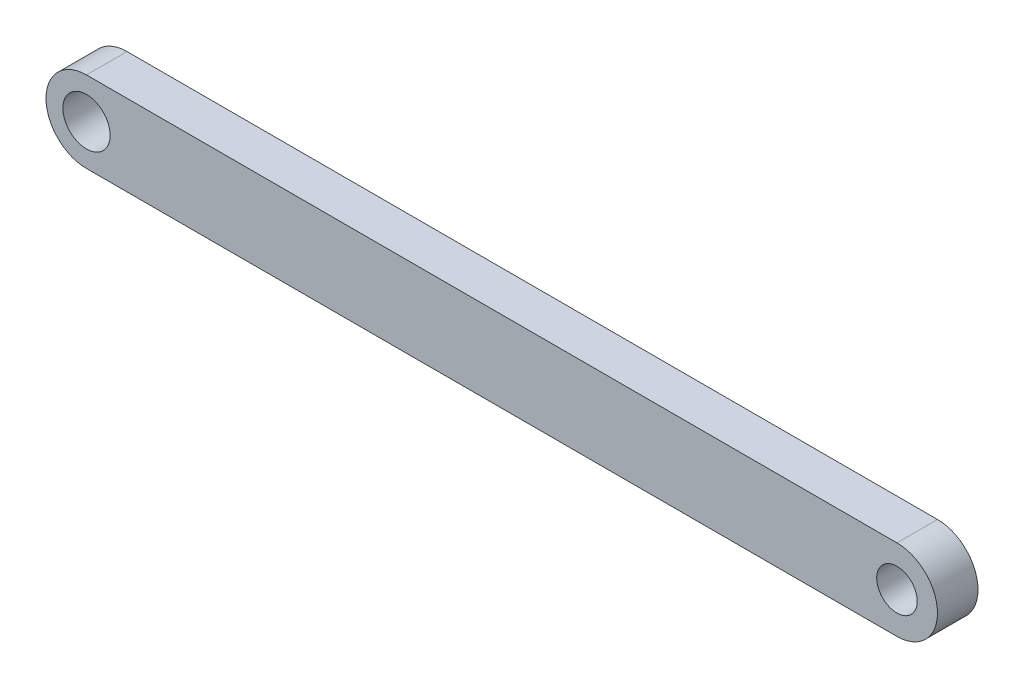
ISO-10303-21;
HEADER;
FILE_DESCRIPTION(('STEP AP214'),'2;1');
FILE_NAME('part.step','',(''),(''),'','','');
FILE_SCHEMA(('AUTOMOTIVE_DESIGN { 1 0 10303 214 1 1 1 1 }'));
ENDSEC;
DATA;
#1=APPLICATION_CONTEXT('core data for automotive mechanical design processes');
#2=APPLICATION_PROTOCOL_DEFINITION('international standard','automotive_design',2000,#1);
#3=PRODUCT_CONTEXT('',#1,'mechanical');
#4=PRODUCT('Part','Part','',(#3));
#5=PRODUCT_RELATED_PRODUCT_CATEGORY('part','',(#4));
#6=PRODUCT_DEFINITION_FORMATION('','',#4);
#7=PRODUCT_DEFINITION_CONTEXT('part definition',#1,'design');
#8=PRODUCT_DEFINITION('design','',#6,#7);
#9=PRODUCT_DEFINITION_SHAPE('','',#8);
#10=(LENGTH_UNIT() NAMED_UNIT(*) SI_UNIT(.MILLI.,.METRE.));
#11=(NAMED_UNIT(*) PLANE_ANGLE_UNIT() SI_UNIT($,.RADIAN.));
#12=(NAMED_UNIT(*) SI_UNIT($,.STERADIAN.) SOLID_ANGLE_UNIT());
#13=UNCERTAINTY_MEASURE_WITH_UNIT(LENGTH_MEASURE(1.E-05),#10,'distance_accuracy_value','');
#14=(GEOMETRIC_REPRESENTATION_CONTEXT(3) GLOBAL_UNCERTAINTY_ASSIGNED_CONTEXT((#13)) GLOBAL_UNIT_ASSIGNED_CONTEXT((#10,
#11,#12)) REPRESENTATION_CONTEXT('',''));
#15=CARTESIAN_POINT('',(0.,0.,0.));
#16=DIRECTION('',(0.,0.,1.));
#17=DIRECTION('',(1.,0.,0.));
#18=AXIS2_PLACEMENT_3D('',#15,#16,#17);
#19=CARTESIAN_POINT('',(0.,0.,3.));
#20=DIRECTION('',(0.,0.,1.));
#21=DIRECTION('',(1.,0.,0.));
#22=AXIS2_PLACEMENT_3D('',#19,#20,#21);
#23=PLANE('',#22);
#24=CARTESIAN_POINT('',(0.,0.,3.));
#25=DIRECTION('',(0.,0.,1.));
#26=DIRECTION('',(1.,0.,0.));
#27=AXIS2_PLACEMENT_3D('',#24,#25,#26);
#28=CIRCLE('',#27,1.75);
#29=CARTESIAN_POINT('',(1.75,0.,3.));
#30=VERTEX_POINT('',#29);
#31=EDGE_CURVE('E100',#30,#30,#28,.T.);
#32=ORIENTED_EDGE('',*,*,#31,.F.);
#33=EDGE_LOOP('',(#32));
#34=FACE_BOUND('',#33,.T.);
#35=CARTESIAN_POINT('',(0.,0.,3.));
#36=DIRECTION('',(0.,0.,1.));
#37=DIRECTION('',(1.,0.,0.));
#38=AXIS2_PLACEMENT_3D('',#35,#36,#37);
#39=CIRCLE('',#38,3.);
#40=CARTESIAN_POINT('',(0.,3.,3.));
#41=VERTEX_POINT('',#40);
#42=CARTESIAN_POINT('',(0.,-3.,3.));
#43=VERTEX_POINT('',#42);
#44=EDGE_CURVE('E85',#41,#43,#39,.T.);
#45=ORIENTED_EDGE('',*,*,#44,.T.);
#46=DIRECTION('',(1.,0.,0.));
#47=VECTOR('',#46,1.);
#48=CARTESIAN_POINT('',(0.,-3.,3.));
#49=LINE('',#48,#47);
#50=CARTESIAN_POINT('',(60.,-3.,3.));
#51=VERTEX_POINT('',#50);
#52=EDGE_CURVE('E80',#43,#51,#49,.T.);
#53=ORIENTED_EDGE('',*,*,#52,.T.);
#54=CARTESIAN_POINT('',(60.,0.,3.));
#55=DIRECTION('',(0.,0.,1.));
#56=DIRECTION('',(1.,0.,0.));
#57=AXIS2_PLACEMENT_3D('',#54,#55,#56);
#58=CIRCLE('',#57,3.);
#59=CARTESIAN_POINT('',(60.,3.,3.));
#60=VERTEX_POINT('',#59);
#61=EDGE_CURVE('E83',#51,#60,#58,.T.);
#62=ORIENTED_EDGE('',*,*,#61,.T.);
#63=DIRECTION('',(-1.,0.,0.));
#64=VECTOR('',#63,1.);
#65=CARTESIAN_POINT('',(0.,3.,3.));
#66=LINE('',#65,#64);
#67=EDGE_CURVE('E50',#60,#41,#66,.T.);
#68=ORIENTED_EDGE('',*,*,#67,.T.);
#69=EDGE_LOOP('',(#45,#53,#62,#68));
#70=FACE_BOUND('',#69,.T.);
#71=CARTESIAN_POINT('',(60.,0.,3.));
#72=DIRECTION('',(0.,0.,1.));
#73=DIRECTION('',(1.,0.,0.));
#74=AXIS2_PLACEMENT_3D('',#71,#72,#73);
#75=CIRCLE('',#74,1.5);
#76=CARTESIAN_POINT('',(61.5,0.,3.));
#77=VERTEX_POINT('',#76);
#78=EDGE_CURVE('E115',#77,#77,#75,.T.);
#79=ORIENTED_EDGE('',*,*,#78,.F.);
#80=EDGE_LOOP('',(#79));
#81=FACE_BOUND('',#80,.T.);
#82=ADVANCED_FACE('F33',(#34,#70,#81),#23,.T.);
#83=CARTESIAN_POINT('',(0.,0.,0.));
#84=DIRECTION('',(0.,0.,1.));
#85=DIRECTION('',(1.,0.,0.));
#86=AXIS2_PLACEMENT_3D('',#83,#84,#85);
#87=PLANE('',#86);
#88=CARTESIAN_POINT('',(0.,0.,0.));
#89=DIRECTION('',(0.,0.,1.));
#90=DIRECTION('',(1.,0.,0.));
#91=AXIS2_PLACEMENT_3D('',#88,#89,#90);
#92=CIRCLE('',#91,3.);
#93=CARTESIAN_POINT('',(0.,3.,0.));
#94=VERTEX_POINT('',#93);
#95=CARTESIAN_POINT('',(0.,-3.,0.));
#96=VERTEX_POINT('',#95);
#97=EDGE_CURVE('E97',#94,#96,#92,.T.);
#98=ORIENTED_EDGE('',*,*,#97,.F.);
#99=DIRECTION('',(-1.,0.,0.));
#100=VECTOR('',#99,1.);
#101=CARTESIAN_POINT('',(0.,3.,0.));
#102=LINE('',#101,#100);
#103=CARTESIAN_POINT('',(60.,3.,0.));
#104=VERTEX_POINT('',#103);
#105=EDGE_CURVE('E73',#104,#94,#102,.T.);
#106=ORIENTED_EDGE('',*,*,#105,.F.);
#107=CARTESIAN_POINT('',(60.,0.,0.));
#108=DIRECTION('',(0.,0.,1.));
#109=DIRECTION('',(1.,0.,0.));
#110=AXIS2_PLACEMENT_3D('',#107,#108,#109);
#111=CIRCLE('',#110,3.);
#112=CARTESIAN_POINT('',(60.,-3.,0.));
#113=VERTEX_POINT('',#112);
#114=EDGE_CURVE('E67',#113,#104,#111,.T.);
#115=ORIENTED_EDGE('',*,*,#114,.F.);
#116=DIRECTION('',(1.,0.,0.));
#117=VECTOR('',#116,1.);
#118=CARTESIAN_POINT('',(0.,-3.,0.));
#119=LINE('',#118,#117);
#120=EDGE_CURVE('E89',#96,#113,#119,.T.);
#121=ORIENTED_EDGE('',*,*,#120,.F.);
#122=EDGE_LOOP('',(#98,#106,#115,#121));
#123=FACE_BOUND('',#122,.T.);
#124=CARTESIAN_POINT('',(0.,0.,0.));
#125=DIRECTION('',(0.,0.,1.));
#126=DIRECTION('',(1.,0.,0.));
#127=AXIS2_PLACEMENT_3D('',#124,#125,#126);
#128=CIRCLE('',#127,1.75);
#129=CARTESIAN_POINT('',(1.75,0.,0.));
#130=VERTEX_POINT('',#129);
#131=EDGE_CURVE('E112',#130,#130,#128,.T.);
#132=ORIENTED_EDGE('',*,*,#131,.T.);
#133=EDGE_LOOP('',(#132));
#134=FACE_BOUND('',#133,.T.);
#135=CARTESIAN_POINT('',(60.,0.,0.));
#136=DIRECTION('',(0.,0.,1.));
#137=DIRECTION('',(1.,0.,0.));
#138=AXIS2_PLACEMENT_3D('',#135,#136,#137);
#139=CIRCLE('',#138,1.5);
#140=CARTESIAN_POINT('',(61.5,0.,0.));
#141=VERTEX_POINT('',#140);
#142=EDGE_CURVE('E118',#141,#141,#139,.T.);
#143=ORIENTED_EDGE('',*,*,#142,.T.);
#144=EDGE_LOOP('',(#143));
#145=FACE_BOUND('',#144,.T.);
#146=ADVANCED_FACE('F108',(#123,#134,#145),#87,.F.);
#147=CARTESIAN_POINT('',(0.,0.,3.));
#148=DIRECTION('',(0.,0.,-1.));
#149=DIRECTION('',(-1.,0.,0.));
#150=AXIS2_PLACEMENT_3D('',#147,#148,#149);
#151=CYLINDRICAL_SURFACE('',#150,3.);
#152=ORIENTED_EDGE('',*,*,#97,.T.);
#153=DIRECTION('',(0.,0.,-1.));
#154=VECTOR('',#153,1.);
#155=CARTESIAN_POINT('',(0.,-3.,3.));
#156=LINE('',#155,#154);
#157=EDGE_CURVE('E11',#43,#96,#156,.T.);
#158=ORIENTED_EDGE('',*,*,#157,.F.);
#159=ORIENTED_EDGE('',*,*,#44,.F.);
#160=DIRECTION('',(0.,0.,-1.));
#161=VECTOR('',#160,1.);
#162=CARTESIAN_POINT('',(0.,3.,3.));
#163=LINE('',#162,#161);
#164=EDGE_CURVE('E93',#41,#94,#163,.T.);
#165=ORIENTED_EDGE('',*,*,#164,.T.);
#166=EDGE_LOOP('',(#152,#158,#159,#165));
#167=FACE_BOUND('',#166,.T.);
#168=ADVANCED_FACE('F35',(#167),#151,.T.);
#169=CARTESIAN_POINT('',(0.,-3.,3.));
#170=DIRECTION('',(0.,1.,0.));
#171=DIRECTION('',(0.,0.,1.));
#172=AXIS2_PLACEMENT_3D('',#169,#170,#171);
#173=PLANE('',#172);
#174=ORIENTED_EDGE('',*,*,#120,.T.);
#175=DIRECTION('',(0.,0.,-1.));
#176=VECTOR('',#175,1.);
#177=CARTESIAN_POINT('',(60.,-3.,3.));
#178=LINE('',#177,#176);
#179=EDGE_CURVE('E42',#51,#113,#178,.T.);
#180=ORIENTED_EDGE('',*,*,#179,.F.);
#181=ORIENTED_EDGE('',*,*,#52,.F.);
#182=ORIENTED_EDGE('',*,*,#157,.T.);
#183=EDGE_LOOP('',(#174,#180,#181,#182));
#184=FACE_BOUND('',#183,.T.);
#185=ADVANCED_FACE('F88',(#184),#173,.F.);
#186=CARTESIAN_POINT('',(60.,0.,3.));
#187=DIRECTION('',(0.,0.,-1.));
#188=DIRECTION('',(-1.,0.,0.));
#189=AXIS2_PLACEMENT_3D('',#186,#187,#188);
#190=CYLINDRICAL_SURFACE('',#189,3.);
#191=ORIENTED_EDGE('',*,*,#114,.T.);
#192=DIRECTION('',(0.,0.,-1.));
#193=VECTOR('',#192,1.);
#194=CARTESIAN_POINT('',(60.,3.,3.));
#195=LINE('',#194,#193);
#196=EDGE_CURVE('E90',#60,#104,#195,.T.);
#197=ORIENTED_EDGE('',*,*,#196,.F.);
#198=ORIENTED_EDGE('',*,*,#61,.F.);
#199=ORIENTED_EDGE('',*,*,#179,.T.);
#200=EDGE_LOOP('',(#191,#197,#198,#199));
#201=FACE_BOUND('',#200,.T.);
#202=ADVANCED_FACE('F91',(#201),#190,.T.);
#203=CARTESIAN_POINT('',(0.,3.,3.));
#204=DIRECTION('',(0.,-1.,0.));
#205=DIRECTION('',(0.,0.,-1.));
#206=AXIS2_PLACEMENT_3D('',#203,#204,#205);
#207=PLANE('',#206);
#208=ORIENTED_EDGE('',*,*,#105,.T.);
#209=ORIENTED_EDGE('',*,*,#164,.F.);
#210=ORIENTED_EDGE('',*,*,#67,.F.);
#211=ORIENTED_EDGE('',*,*,#196,.T.);
#212=EDGE_LOOP('',(#208,#209,#210,#211));
#213=FACE_BOUND('',#212,.T.);
#214=ADVANCED_FACE('F105',(#213),#207,.F.);
#215=CARTESIAN_POINT('',(0.,0.,3.));
#216=DIRECTION('',(0.,0.,-1.));
#217=DIRECTION('',(-1.,0.,0.));
#218=AXIS2_PLACEMENT_3D('',#215,#216,#217);
#219=CYLINDRICAL_SURFACE('',#218,1.75);
#220=ORIENTED_EDGE('',*,*,#31,.T.);
#221=EDGE_LOOP('',(#220));
#222=FACE_BOUND('',#221,.T.);
#223=ORIENTED_EDGE('',*,*,#131,.F.);
#224=EDGE_LOOP('',(#223));
#225=FACE_BOUND('',#224,.T.);
#226=ADVANCED_FACE('F135',(#222,#225),#219,.F.);
#227=CARTESIAN_POINT('',(60.,0.,3.));
#228=DIRECTION('',(0.,0.,-1.));
#229=DIRECTION('',(-1.,0.,0.));
#230=AXIS2_PLACEMENT_3D('',#227,#228,#229);
#231=CYLINDRICAL_SURFACE('',#230,1.5);
#232=ORIENTED_EDGE('',*,*,#78,.T.);
#233=EDGE_LOOP('',(#232));
#234=FACE_BOUND('',#233,.T.);
#235=ORIENTED_EDGE('',*,*,#142,.F.);
#236=EDGE_LOOP('',(#235));
#237=FACE_BOUND('',#236,.T.);
#238=ADVANCED_FACE('F124',(#234,#237),#231,.F.);
#239=CLOSED_SHELL('',(#82,#146,#168,#185,#202,#214,#226,#238));
#240=MANIFOLD_SOLID_BREP('B2',#239);
#241=ADVANCED_BREP_SHAPE_REPRESENTATION('',(#18,#240),#14);
#242=SHAPE_DEFINITION_REPRESENTATION(#9,#241);
ENDSEC;
END-ISO-10303-21;
